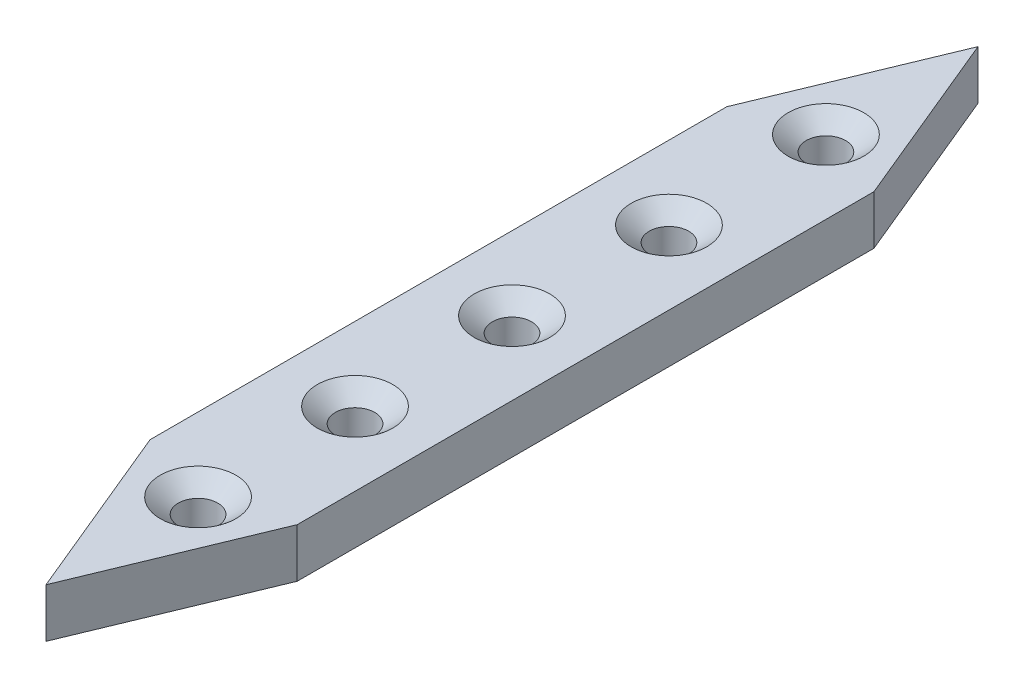
ISO-10303-21;
HEADER;
FILE_DESCRIPTION(('STEP AP214'),'2;1');
FILE_NAME('part.step','',(''),(''),'','','');
FILE_SCHEMA(('AUTOMOTIVE_DESIGN { 1 0 10303 214 1 1 1 1 }'));
ENDSEC;
DATA;
#1=APPLICATION_CONTEXT('core data for automotive mechanical design processes');
#2=APPLICATION_PROTOCOL_DEFINITION('international standard','automotive_design',2000,#1);
#3=PRODUCT_CONTEXT('',#1,'mechanical');
#4=PRODUCT('Part','Part','',(#3));
#5=PRODUCT_RELATED_PRODUCT_CATEGORY('part','',(#4));
#6=PRODUCT_DEFINITION_FORMATION('','',#4);
#7=PRODUCT_DEFINITION_CONTEXT('part definition',#1,'design');
#8=PRODUCT_DEFINITION('design','',#6,#7);
#9=PRODUCT_DEFINITION_SHAPE('','',#8);
#10=(LENGTH_UNIT() NAMED_UNIT(*) SI_UNIT(.MILLI.,.METRE.));
#11=(NAMED_UNIT(*) PLANE_ANGLE_UNIT() SI_UNIT($,.RADIAN.));
#12=(NAMED_UNIT(*) SI_UNIT($,.STERADIAN.) SOLID_ANGLE_UNIT());
#13=UNCERTAINTY_MEASURE_WITH_UNIT(LENGTH_MEASURE(1.E-05),#10,'distance_accuracy_value','');
#14=(GEOMETRIC_REPRESENTATION_CONTEXT(3) GLOBAL_UNCERTAINTY_ASSIGNED_CONTEXT((#13)) GLOBAL_UNIT_ASSIGNED_CONTEXT((#10,
#11,#12)) REPRESENTATION_CONTEXT('',''));
#15=CARTESIAN_POINT('',(0.,0.,0.));
#16=DIRECTION('',(0.,0.,1.));
#17=DIRECTION('',(1.,0.,0.));
#18=AXIS2_PLACEMENT_3D('',#15,#16,#17);
#19=CARTESIAN_POINT('',(0.,6.35,-60.325));
#20=DIRECTION('',(-0.923879532511287,0.,0.38268343236509));
#21=DIRECTION('',(0.38268343236509,0.,0.923879532511287));
#22=AXIS2_PLACEMENT_3D('',#19,#20,#21);
#23=PLANE('',#22);
#24=DIRECTION('',(-0.382683432365091,0.,-0.923879532511287));
#25=VECTOR('',#24,1.);
#26=CARTESIAN_POINT('',(0.,0.,-60.325));
#27=LINE('',#26,#25);
#28=CARTESIAN_POINT('',(9.525,0.,-37.3296158183963));
#29=VERTEX_POINT('',#28);
#30=CARTESIAN_POINT('',(0.,0.,-60.325));
#31=VERTEX_POINT('',#30);
#32=EDGE_CURVE('E119',#29,#31,#27,.T.);
#33=ORIENTED_EDGE('',*,*,#32,.T.);
#34=DIRECTION('',(0.,-1.,0.));
#35=VECTOR('',#34,1.);
#36=CARTESIAN_POINT('',(0.,6.35,-60.325));
#37=LINE('',#36,#35);
#38=CARTESIAN_POINT('',(0.,6.35,-60.325));
#39=VERTEX_POINT('',#38);
#40=EDGE_CURVE('E11',#39,#31,#37,.T.);
#41=ORIENTED_EDGE('',*,*,#40,.F.);
#42=DIRECTION('',(-0.382683432365091,0.,-0.923879532511287));
#43=VECTOR('',#42,1.);
#44=CARTESIAN_POINT('',(0.,6.35,-60.325));
#45=LINE('',#44,#43);
#46=CARTESIAN_POINT('',(9.525,6.35,-37.3296158183963));
#47=VERTEX_POINT('',#46);
#48=EDGE_CURVE('E130',#47,#39,#45,.T.);
#49=ORIENTED_EDGE('',*,*,#48,.F.);
#50=DIRECTION('',(0.,-1.,0.));
#51=VECTOR('',#50,1.);
#52=CARTESIAN_POINT('',(9.525,6.35,-37.3296158183963));
#53=LINE('',#52,#51);
#54=EDGE_CURVE('E115',#47,#29,#53,.T.);
#55=ORIENTED_EDGE('',*,*,#54,.T.);
#56=EDGE_LOOP('',(#33,#41,#49,#55));
#57=FACE_BOUND('',#56,.T.);
#58=ADVANCED_FACE('F35',(#57),#23,.F.);
#59=CARTESIAN_POINT('',(0.,6.35,-60.325));
#60=DIRECTION('',(0.923879532511287,0.,0.38268343236509));
#61=DIRECTION('',(0.38268343236509,0.,-0.923879532511287));
#62=AXIS2_PLACEMENT_3D('',#59,#60,#61);
#63=PLANE('',#62);
#64=DIRECTION('',(-0.38268343236509,0.,0.923879532511287));
#65=VECTOR('',#64,1.);
#66=CARTESIAN_POINT('',(0.,0.,-60.325));
#67=LINE('',#66,#65);
#68=CARTESIAN_POINT('',(-9.52499999999999,0.,-37.3296158183963));
#69=VERTEX_POINT('',#68);
#70=EDGE_CURVE('E122',#31,#69,#67,.T.);
#71=ORIENTED_EDGE('',*,*,#70,.T.);
#72=DIRECTION('',(0.,-1.,0.));
#73=VECTOR('',#72,1.);
#74=CARTESIAN_POINT('',(-9.52499999999999,6.35,-37.3296158183963));
#75=LINE('',#74,#73);
#76=CARTESIAN_POINT('',(-9.52499999999999,6.35,-37.3296158183963));
#77=VERTEX_POINT('',#76);
#78=EDGE_CURVE('E43',#77,#69,#75,.T.);
#79=ORIENTED_EDGE('',*,*,#78,.F.);
#80=DIRECTION('',(-0.38268343236509,0.,0.923879532511287));
#81=VECTOR('',#80,1.);
#82=CARTESIAN_POINT('',(0.,6.35,-60.325));
#83=LINE('',#82,#81);
#84=EDGE_CURVE('E88',#39,#77,#83,.T.);
#85=ORIENTED_EDGE('',*,*,#84,.F.);
#86=ORIENTED_EDGE('',*,*,#40,.T.);
#87=EDGE_LOOP('',(#71,#79,#85,#86));
#88=FACE_BOUND('',#87,.T.);
#89=ADVANCED_FACE('F155',(#88),#63,.F.);
#90=CARTESIAN_POINT('',(-9.52499999999999,6.35,-37.3296158183963));
#91=DIRECTION('',(1.,0.,0.));
#92=DIRECTION('',(0.,0.,-1.));
#93=AXIS2_PLACEMENT_3D('',#90,#91,#92);
#94=PLANE('',#93);
#95=DIRECTION('',(0.,0.,1.));
#96=VECTOR('',#95,1.);
#97=CARTESIAN_POINT('',(-9.52499999999999,0.,-37.3296158183963));
#98=LINE('',#97,#96);
#99=CARTESIAN_POINT('',(-9.52499999999999,0.,37.3296158183963));
#100=VERTEX_POINT('',#99);
#101=EDGE_CURVE('E125',#69,#100,#98,.T.);
#102=ORIENTED_EDGE('',*,*,#101,.T.);
#103=DIRECTION('',(0.,-1.,0.));
#104=VECTOR('',#103,1.);
#105=CARTESIAN_POINT('',(-9.52499999999999,6.35,37.3296158183963));
#106=LINE('',#105,#104);
#107=CARTESIAN_POINT('',(-9.52499999999999,6.35,37.3296158183963));
#108=VERTEX_POINT('',#107);
#109=EDGE_CURVE('E110',#108,#100,#106,.T.);
#110=ORIENTED_EDGE('',*,*,#109,.F.);
#111=DIRECTION('',(0.,0.,1.));
#112=VECTOR('',#111,1.);
#113=CARTESIAN_POINT('',(-9.52499999999999,6.35,-37.3296158183963));
#114=LINE('',#113,#112);
#115=EDGE_CURVE('E101',#77,#108,#114,.T.);
#116=ORIENTED_EDGE('',*,*,#115,.F.);
#117=ORIENTED_EDGE('',*,*,#78,.T.);
#118=EDGE_LOOP('',(#102,#110,#116,#117));
#119=FACE_BOUND('',#118,.T.);
#120=ADVANCED_FACE('F136',(#119),#94,.F.);
#121=CARTESIAN_POINT('',(0.,6.35,60.325));
#122=DIRECTION('',(0.923879532511287,0.,-0.38268343236509));
#123=DIRECTION('',(-0.38268343236509,0.,-0.923879532511287));
#124=AXIS2_PLACEMENT_3D('',#121,#122,#123);
#125=PLANE('',#124);
#126=DIRECTION('',(0.38268343236509,0.,0.923879532511287));
#127=VECTOR('',#126,1.);
#128=CARTESIAN_POINT('',(0.,0.,60.325));
#129=LINE('',#128,#127);
#130=CARTESIAN_POINT('',(0.,0.,60.325));
#131=VERTEX_POINT('',#130);
#132=EDGE_CURVE('E109',#100,#131,#129,.T.);
#133=ORIENTED_EDGE('',*,*,#132,.T.);
#134=DIRECTION('',(0.,-1.,0.));
#135=VECTOR('',#134,1.);
#136=CARTESIAN_POINT('',(0.,6.35,60.325));
#137=LINE('',#136,#135);
#138=CARTESIAN_POINT('',(0.,6.35,60.325));
#139=VERTEX_POINT('',#138);
#140=EDGE_CURVE('E106',#139,#131,#137,.T.);
#141=ORIENTED_EDGE('',*,*,#140,.F.);
#142=DIRECTION('',(0.38268343236509,0.,0.923879532511287));
#143=VECTOR('',#142,1.);
#144=CARTESIAN_POINT('',(0.,6.35,60.325));
#145=LINE('',#144,#143);
#146=EDGE_CURVE('E95',#108,#139,#145,.T.);
#147=ORIENTED_EDGE('',*,*,#146,.F.);
#148=ORIENTED_EDGE('',*,*,#109,.T.);
#149=EDGE_LOOP('',(#133,#141,#147,#148));
#150=FACE_BOUND('',#149,.T.);
#151=ADVANCED_FACE('F107',(#150),#125,.F.);
#152=CARTESIAN_POINT('',(0.,6.35,60.325));
#153=DIRECTION('',(-0.923879532511287,0.,-0.38268343236509));
#154=DIRECTION('',(-0.38268343236509,0.,0.923879532511287));
#155=AXIS2_PLACEMENT_3D('',#152,#153,#154);
#156=PLANE('',#155);
#157=DIRECTION('',(0.382683432365091,0.,-0.923879532511287));
#158=VECTOR('',#157,1.);
#159=CARTESIAN_POINT('',(0.,0.,60.325));
#160=LINE('',#159,#158);
#161=CARTESIAN_POINT('',(9.525,0.,37.3296158183963));
#162=VERTEX_POINT('',#161);
#163=EDGE_CURVE('E74',#131,#162,#160,.T.);
#164=ORIENTED_EDGE('',*,*,#163,.T.);
#165=DIRECTION('',(0.,-1.,0.));
#166=VECTOR('',#165,1.);
#167=CARTESIAN_POINT('',(9.525,6.35,37.3296158183963));
#168=LINE('',#167,#166);
#169=CARTESIAN_POINT('',(9.525,6.35,37.3296158183963));
#170=VERTEX_POINT('',#169);
#171=EDGE_CURVE('E111',#170,#162,#168,.T.);
#172=ORIENTED_EDGE('',*,*,#171,.F.);
#173=DIRECTION('',(0.382683432365091,0.,-0.923879532511287));
#174=VECTOR('',#173,1.);
#175=CARTESIAN_POINT('',(0.,6.35,60.325));
#176=LINE('',#175,#174);
#177=EDGE_CURVE('E99',#139,#170,#176,.T.);
#178=ORIENTED_EDGE('',*,*,#177,.F.);
#179=ORIENTED_EDGE('',*,*,#140,.T.);
#180=EDGE_LOOP('',(#164,#172,#178,#179));
#181=FACE_BOUND('',#180,.T.);
#182=ADVANCED_FACE('F113',(#181),#156,.F.);
#183=CARTESIAN_POINT('',(9.525,6.35,-37.3296158183963));
#184=DIRECTION('',(-1.,0.,0.));
#185=DIRECTION('',(0.,0.,1.));
#186=AXIS2_PLACEMENT_3D('',#183,#184,#185);
#187=PLANE('',#186);
#188=DIRECTION('',(0.,0.,-1.));
#189=VECTOR('',#188,1.);
#190=CARTESIAN_POINT('',(9.525,0.,-37.3296158183963));
#191=LINE('',#190,#189);
#192=EDGE_CURVE('E80',#162,#29,#191,.T.);
#193=ORIENTED_EDGE('',*,*,#192,.T.);
#194=ORIENTED_EDGE('',*,*,#54,.F.);
#195=DIRECTION('',(0.,0.,-1.));
#196=VECTOR('',#195,1.);
#197=CARTESIAN_POINT('',(9.525,6.35,-37.3296158183963));
#198=LINE('',#197,#196);
#199=EDGE_CURVE('E51',#170,#47,#198,.T.);
#200=ORIENTED_EDGE('',*,*,#199,.F.);
#201=ORIENTED_EDGE('',*,*,#171,.T.);
#202=EDGE_LOOP('',(#193,#194,#200,#201));
#203=FACE_BOUND('',#202,.T.);
#204=ADVANCED_FACE('F143',(#203),#187,.F.);
#205=CARTESIAN_POINT('',(0.,6.35,0.));
#206=DIRECTION('',(0.,1.,0.));
#207=DIRECTION('',(0.,0.,1.));
#208=AXIS2_PLACEMENT_3D('',#205,#206,#207);
#209=PLANE('',#208);
#210=CARTESIAN_POINT('',(0.,6.35,-20.32));
#211=DIRECTION('',(0.,1.,0.));
#212=DIRECTION('',(0.,0.,1.));
#213=AXIS2_PLACEMENT_3D('',#210,#211,#212);
#214=CIRCLE('',#213,4.8895);
#215=CARTESIAN_POINT('',(0.,6.35,-15.4305));
#216=VERTEX_POINT('',#215);
#217=EDGE_CURVE('E307',#216,#216,#214,.T.);
#218=ORIENTED_EDGE('',*,*,#217,.F.);
#219=EDGE_LOOP('',(#218));
#220=FACE_BOUND('',#219,.T.);
#221=CARTESIAN_POINT('',(0.,6.35,-40.64));
#222=DIRECTION('',(0.,1.,0.));
#223=DIRECTION('',(0.,0.,1.));
#224=AXIS2_PLACEMENT_3D('',#221,#222,#223);
#225=CIRCLE('',#224,4.8895);
#226=CARTESIAN_POINT('',(0.,6.35,-35.7505));
#227=VERTEX_POINT('',#226);
#228=EDGE_CURVE('E314',#227,#227,#225,.T.);
#229=ORIENTED_EDGE('',*,*,#228,.F.);
#230=EDGE_LOOP('',(#229));
#231=FACE_BOUND('',#230,.T.);
#232=CARTESIAN_POINT('',(0.,6.35,0.));
#233=DIRECTION('',(0.,1.,0.));
#234=DIRECTION('',(0.,0.,1.));
#235=AXIS2_PLACEMENT_3D('',#232,#233,#234);
#236=CIRCLE('',#235,4.8895);
#237=CARTESIAN_POINT('',(0.,6.35,4.8895));
#238=VERTEX_POINT('',#237);
#239=EDGE_CURVE('E323',#238,#238,#236,.T.);
#240=ORIENTED_EDGE('',*,*,#239,.F.);
#241=EDGE_LOOP('',(#240));
#242=FACE_BOUND('',#241,.T.);
#243=CARTESIAN_POINT('',(0.,6.35,20.32));
#244=DIRECTION('',(0.,1.,0.));
#245=DIRECTION('',(0.,0.,1.));
#246=AXIS2_PLACEMENT_3D('',#243,#244,#245);
#247=CIRCLE('',#246,4.8895);
#248=CARTESIAN_POINT('',(0.,6.35,25.2095));
#249=VERTEX_POINT('',#248);
#250=EDGE_CURVE('E332',#249,#249,#247,.T.);
#251=ORIENTED_EDGE('',*,*,#250,.F.);
#252=EDGE_LOOP('',(#251));
#253=FACE_BOUND('',#252,.T.);
#254=CARTESIAN_POINT('',(0.,6.35,40.64));
#255=DIRECTION('',(0.,1.,0.));
#256=DIRECTION('',(0.,0.,1.));
#257=AXIS2_PLACEMENT_3D('',#254,#255,#256);
#258=CIRCLE('',#257,4.8895);
#259=CARTESIAN_POINT('',(0.,6.35,45.5295));
#260=VERTEX_POINT('',#259);
#261=EDGE_CURVE('E341',#260,#260,#258,.T.);
#262=ORIENTED_EDGE('',*,*,#261,.F.);
#263=EDGE_LOOP('',(#262));
#264=FACE_BOUND('',#263,.T.);
#265=ORIENTED_EDGE('',*,*,#48,.T.);
#266=ORIENTED_EDGE('',*,*,#84,.T.);
#267=ORIENTED_EDGE('',*,*,#115,.T.);
#268=ORIENTED_EDGE('',*,*,#146,.T.);
#269=ORIENTED_EDGE('',*,*,#177,.T.);
#270=ORIENTED_EDGE('',*,*,#199,.T.);
#271=EDGE_LOOP('',(#265,#266,#267,#268,#269,#270));
#272=FACE_BOUND('',#271,.T.);
#273=ADVANCED_FACE('F97',(#220,#231,#242,#253,#264,#272),#209,.T.);
#274=CARTESIAN_POINT('',(0.,0.,0.));
#275=DIRECTION('',(0.,1.,0.));
#276=DIRECTION('',(0.,0.,1.));
#277=AXIS2_PLACEMENT_3D('',#274,#275,#276);
#278=PLANE('',#277);
#279=CARTESIAN_POINT('',(0.,0.,-20.32));
#280=DIRECTION('',(0.,1.,0.));
#281=DIRECTION('',(0.,0.,1.));
#282=AXIS2_PLACEMENT_3D('',#279,#280,#281);
#283=CIRCLE('',#282,2.5527);
#284=CARTESIAN_POINT('',(0.,0.,-17.7673));
#285=VERTEX_POINT('',#284);
#286=EDGE_CURVE('E309',#285,#285,#283,.T.);
#287=ORIENTED_EDGE('',*,*,#286,.T.);
#288=EDGE_LOOP('',(#287));
#289=FACE_BOUND('',#288,.T.);
#290=CARTESIAN_POINT('',(0.,0.,-40.64));
#291=DIRECTION('',(0.,1.,0.));
#292=DIRECTION('',(0.,0.,1.));
#293=AXIS2_PLACEMENT_3D('',#290,#291,#292);
#294=CIRCLE('',#293,2.5527);
#295=CARTESIAN_POINT('',(0.,0.,-38.0873));
#296=VERTEX_POINT('',#295);
#297=EDGE_CURVE('E320',#296,#296,#294,.T.);
#298=ORIENTED_EDGE('',*,*,#297,.T.);
#299=EDGE_LOOP('',(#298));
#300=FACE_BOUND('',#299,.T.);
#301=CARTESIAN_POINT('',(0.,0.,0.));
#302=DIRECTION('',(0.,1.,0.));
#303=DIRECTION('',(0.,0.,1.));
#304=AXIS2_PLACEMENT_3D('',#301,#302,#303);
#305=CIRCLE('',#304,2.5527);
#306=CARTESIAN_POINT('',(0.,0.,2.5527));
#307=VERTEX_POINT('',#306);
#308=EDGE_CURVE('E329',#307,#307,#305,.T.);
#309=ORIENTED_EDGE('',*,*,#308,.T.);
#310=EDGE_LOOP('',(#309));
#311=FACE_BOUND('',#310,.T.);
#312=CARTESIAN_POINT('',(0.,0.,20.32));
#313=DIRECTION('',(0.,1.,0.));
#314=DIRECTION('',(0.,0.,1.));
#315=AXIS2_PLACEMENT_3D('',#312,#313,#314);
#316=CIRCLE('',#315,2.5527);
#317=CARTESIAN_POINT('',(0.,0.,22.8727));
#318=VERTEX_POINT('',#317);
#319=EDGE_CURVE('E338',#318,#318,#316,.T.);
#320=ORIENTED_EDGE('',*,*,#319,.T.);
#321=EDGE_LOOP('',(#320));
#322=FACE_BOUND('',#321,.T.);
#323=CARTESIAN_POINT('',(0.,0.,40.64));
#324=DIRECTION('',(0.,1.,0.));
#325=DIRECTION('',(0.,0.,1.));
#326=AXIS2_PLACEMENT_3D('',#323,#324,#325);
#327=CIRCLE('',#326,2.5527);
#328=CARTESIAN_POINT('',(0.,0.,43.1927));
#329=VERTEX_POINT('',#328);
#330=EDGE_CURVE('E123',#329,#329,#327,.T.);
#331=ORIENTED_EDGE('',*,*,#330,.T.);
#332=EDGE_LOOP('',(#331));
#333=FACE_BOUND('',#332,.T.);
#334=ORIENTED_EDGE('',*,*,#32,.F.);
#335=ORIENTED_EDGE('',*,*,#192,.F.);
#336=ORIENTED_EDGE('',*,*,#163,.F.);
#337=ORIENTED_EDGE('',*,*,#132,.F.);
#338=ORIENTED_EDGE('',*,*,#101,.F.);
#339=ORIENTED_EDGE('',*,*,#70,.F.);
#340=EDGE_LOOP('',(#334,#335,#336,#337,#338,#339));
#341=FACE_BOUND('',#340,.T.);
#342=ADVANCED_FACE('F139',(#289,#300,#311,#322,#333,#341),#278,.F.);
#343=CARTESIAN_POINT('',(0.,6.35,40.64));
#344=DIRECTION('',(0.,1.,0.));
#345=DIRECTION('',(0.,0.,1.));
#346=AXIS2_PLACEMENT_3D('',#343,#344,#345);
#347=CYLINDRICAL_SURFACE('',#346,2.5527);
#348=ORIENTED_EDGE('',*,*,#330,.F.);
#349=EDGE_LOOP('',(#348));
#350=FACE_BOUND('',#349,.T.);
#351=CARTESIAN_POINT('',(0.,4.38919198186493,40.64));
#352=DIRECTION('',(0.,1.,0.));
#353=DIRECTION('',(0.,0.,1.));
#354=AXIS2_PLACEMENT_3D('',#351,#352,#353);
#355=CIRCLE('',#354,2.5527);
#356=CARTESIAN_POINT('',(0.,4.38919198186493,43.1927));
#357=VERTEX_POINT('',#356);
#358=EDGE_CURVE('E344',#357,#357,#355,.T.);
#359=ORIENTED_EDGE('',*,*,#358,.T.);
#360=EDGE_LOOP('',(#359));
#361=FACE_BOUND('',#360,.T.);
#362=ADVANCED_FACE('F192',(#350,#361),#347,.F.);
#363=CARTESIAN_POINT('',(0.,6.35,40.64));
#364=DIRECTION('',(0.,1.,0.));
#365=DIRECTION('',(0.,0.,1.));
#366=AXIS2_PLACEMENT_3D('',#363,#364,#365);
#367=CONICAL_SURFACE('',#366,4.8895,0.872664625997164);
#368=ORIENTED_EDGE('',*,*,#358,.F.);
#369=EDGE_LOOP('',(#368));
#370=FACE_BOUND('',#369,.T.);
#371=ORIENTED_EDGE('',*,*,#261,.T.);
#372=EDGE_LOOP('',(#371));
#373=FACE_BOUND('',#372,.T.);
#374=ADVANCED_FACE('F201',(#370,#373),#367,.F.);
#375=CARTESIAN_POINT('',(0.,6.35,20.32));
#376=DIRECTION('',(0.,1.,0.));
#377=DIRECTION('',(0.,0.,1.));
#378=AXIS2_PLACEMENT_3D('',#375,#376,#377);
#379=CYLINDRICAL_SURFACE('',#378,2.5527);
#380=ORIENTED_EDGE('',*,*,#319,.F.);
#381=EDGE_LOOP('',(#380));
#382=FACE_BOUND('',#381,.T.);
#383=CARTESIAN_POINT('',(0.,4.38919198186493,20.32));
#384=DIRECTION('',(0.,1.,0.));
#385=DIRECTION('',(0.,0.,1.));
#386=AXIS2_PLACEMENT_3D('',#383,#384,#385);
#387=CIRCLE('',#386,2.5527);
#388=CARTESIAN_POINT('',(0.,4.38919198186493,22.8727));
#389=VERTEX_POINT('',#388);
#390=EDGE_CURVE('E335',#389,#389,#387,.T.);
#391=ORIENTED_EDGE('',*,*,#390,.T.);
#392=EDGE_LOOP('',(#391));
#393=FACE_BOUND('',#392,.T.);
#394=ADVANCED_FACE('F212',(#382,#393),#379,.F.);
#395=CARTESIAN_POINT('',(0.,6.35,20.32));
#396=DIRECTION('',(0.,1.,0.));
#397=DIRECTION('',(0.,0.,1.));
#398=AXIS2_PLACEMENT_3D('',#395,#396,#397);
#399=CONICAL_SURFACE('',#398,4.8895,0.872664625997164);
#400=ORIENTED_EDGE('',*,*,#390,.F.);
#401=EDGE_LOOP('',(#400));
#402=FACE_BOUND('',#401,.T.);
#403=ORIENTED_EDGE('',*,*,#250,.T.);
#404=EDGE_LOOP('',(#403));
#405=FACE_BOUND('',#404,.T.);
#406=ADVANCED_FACE('F224',(#402,#405),#399,.F.);
#407=CARTESIAN_POINT('',(0.,6.35,0.));
#408=DIRECTION('',(0.,1.,0.));
#409=DIRECTION('',(0.,0.,1.));
#410=AXIS2_PLACEMENT_3D('',#407,#408,#409);
#411=CYLINDRICAL_SURFACE('',#410,2.5527);
#412=ORIENTED_EDGE('',*,*,#308,.F.);
#413=EDGE_LOOP('',(#412));
#414=FACE_BOUND('',#413,.T.);
#415=CARTESIAN_POINT('',(0.,4.38919198186493,0.));
#416=DIRECTION('',(0.,1.,0.));
#417=DIRECTION('',(0.,0.,1.));
#418=AXIS2_PLACEMENT_3D('',#415,#416,#417);
#419=CIRCLE('',#418,2.5527);
#420=CARTESIAN_POINT('',(0.,4.38919198186493,2.5527));
#421=VERTEX_POINT('',#420);
#422=EDGE_CURVE('E326',#421,#421,#419,.T.);
#423=ORIENTED_EDGE('',*,*,#422,.T.);
#424=EDGE_LOOP('',(#423));
#425=FACE_BOUND('',#424,.T.);
#426=ADVANCED_FACE('F234',(#414,#425),#411,.F.);
#427=CARTESIAN_POINT('',(0.,6.35,0.));
#428=DIRECTION('',(0.,1.,0.));
#429=DIRECTION('',(0.,0.,1.));
#430=AXIS2_PLACEMENT_3D('',#427,#428,#429);
#431=CONICAL_SURFACE('',#430,4.8895,0.872664625997164);
#432=ORIENTED_EDGE('',*,*,#422,.F.);
#433=EDGE_LOOP('',(#432));
#434=FACE_BOUND('',#433,.T.);
#435=ORIENTED_EDGE('',*,*,#239,.T.);
#436=EDGE_LOOP('',(#435));
#437=FACE_BOUND('',#436,.T.);
#438=ADVANCED_FACE('F245',(#434,#437),#431,.F.);
#439=CARTESIAN_POINT('',(0.,6.35,-40.64));
#440=DIRECTION('',(0.,1.,0.));
#441=DIRECTION('',(0.,0.,1.));
#442=AXIS2_PLACEMENT_3D('',#439,#440,#441);
#443=CYLINDRICAL_SURFACE('',#442,2.5527);
#444=ORIENTED_EDGE('',*,*,#297,.F.);
#445=EDGE_LOOP('',(#444));
#446=FACE_BOUND('',#445,.T.);
#447=CARTESIAN_POINT('',(0.,4.38919198186493,-40.64));
#448=DIRECTION('',(0.,1.,0.));
#449=DIRECTION('',(0.,0.,1.));
#450=AXIS2_PLACEMENT_3D('',#447,#448,#449);
#451=CIRCLE('',#450,2.5527);
#452=CARTESIAN_POINT('',(0.,4.38919198186493,-38.0873));
#453=VERTEX_POINT('',#452);
#454=EDGE_CURVE('E317',#453,#453,#451,.T.);
#455=ORIENTED_EDGE('',*,*,#454,.T.);
#456=EDGE_LOOP('',(#455));
#457=FACE_BOUND('',#456,.T.);
#458=ADVANCED_FACE('F255',(#446,#457),#443,.F.);
#459=CARTESIAN_POINT('',(0.,6.35,-40.64));
#460=DIRECTION('',(0.,1.,0.));
#461=DIRECTION('',(0.,0.,1.));
#462=AXIS2_PLACEMENT_3D('',#459,#460,#461);
#463=CONICAL_SURFACE('',#462,4.8895,0.872664625997164);
#464=ORIENTED_EDGE('',*,*,#454,.F.);
#465=EDGE_LOOP('',(#464));
#466=FACE_BOUND('',#465,.T.);
#467=ORIENTED_EDGE('',*,*,#228,.T.);
#468=EDGE_LOOP('',(#467));
#469=FACE_BOUND('',#468,.T.);
#470=ADVANCED_FACE('F265',(#466,#469),#463,.F.);
#471=CARTESIAN_POINT('',(0.,6.35,-20.32));
#472=DIRECTION('',(0.,1.,0.));
#473=DIRECTION('',(0.,0.,1.));
#474=AXIS2_PLACEMENT_3D('',#471,#472,#473);
#475=CYLINDRICAL_SURFACE('',#474,2.5527);
#476=ORIENTED_EDGE('',*,*,#286,.F.);
#477=EDGE_LOOP('',(#476));
#478=FACE_BOUND('',#477,.T.);
#479=CARTESIAN_POINT('',(0.,4.38919198186493,-20.32));
#480=DIRECTION('',(0.,1.,0.));
#481=DIRECTION('',(0.,0.,1.));
#482=AXIS2_PLACEMENT_3D('',#479,#480,#481);
#483=CIRCLE('',#482,2.5527);
#484=CARTESIAN_POINT('',(0.,4.38919198186493,-17.7673));
#485=VERTEX_POINT('',#484);
#486=EDGE_CURVE('E304',#485,#485,#483,.T.);
#487=ORIENTED_EDGE('',*,*,#486,.T.);
#488=EDGE_LOOP('',(#487));
#489=FACE_BOUND('',#488,.T.);
#490=ADVANCED_FACE('F276',(#478,#489),#475,.F.);
#491=CARTESIAN_POINT('',(0.,6.35,-20.32));
#492=DIRECTION('',(0.,1.,0.));
#493=DIRECTION('',(0.,0.,1.));
#494=AXIS2_PLACEMENT_3D('',#491,#492,#493);
#495=CONICAL_SURFACE('',#494,4.8895,0.872664625997164);
#496=ORIENTED_EDGE('',*,*,#486,.F.);
#497=EDGE_LOOP('',(#496));
#498=FACE_BOUND('',#497,.T.);
#499=ORIENTED_EDGE('',*,*,#217,.T.);
#500=EDGE_LOOP('',(#499));
#501=FACE_BOUND('',#500,.T.);
#502=ADVANCED_FACE('F286',(#498,#501),#495,.F.);
#503=CLOSED_SHELL('',(#58,#89,#120,#151,#182,#204,#273,#342,#362,#374,#394,#406,#426,#438,#458,
#470,#490,#502));
#504=MANIFOLD_SOLID_BREP('B2',#503);
#505=ADVANCED_BREP_SHAPE_REPRESENTATION('',(#18,#504),#14);
#506=SHAPE_DEFINITION_REPRESENTATION(#9,#505);
ENDSEC;
END-ISO-10303-21;
